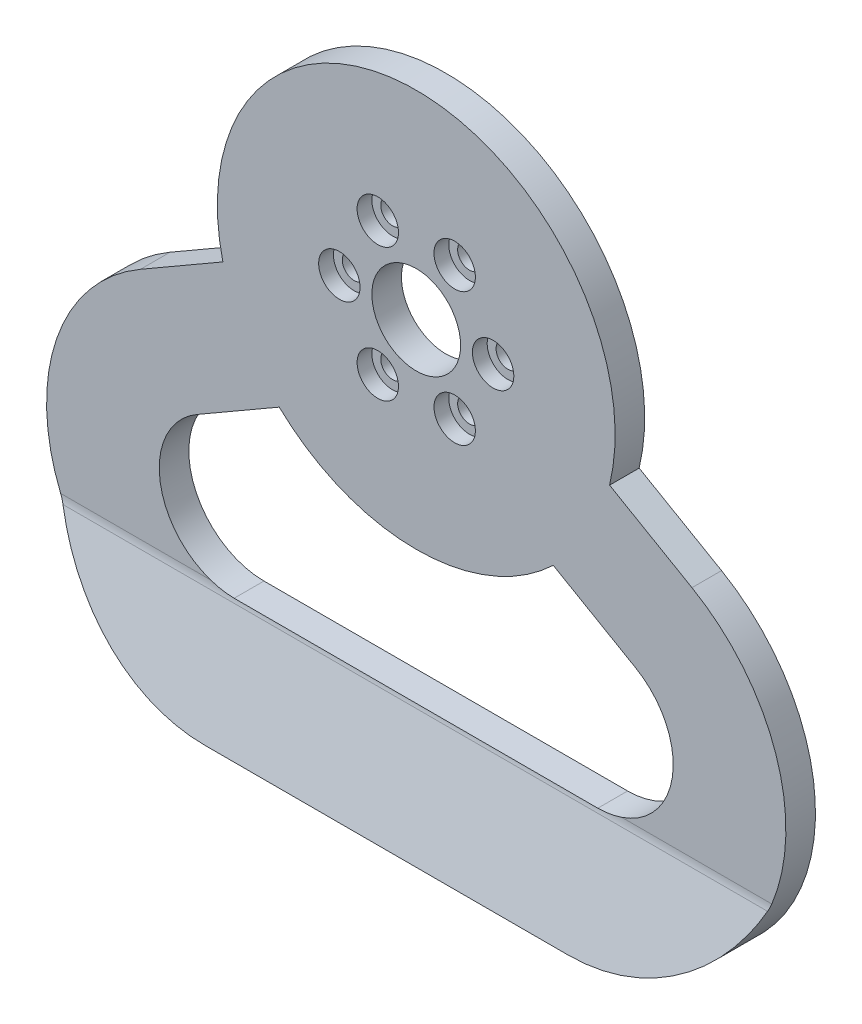
ISO-10303-21;
HEADER;
FILE_DESCRIPTION(('STEP AP214'),'2;1');
FILE_NAME('part.step','',(''),(''),'','','');
FILE_SCHEMA(('AUTOMOTIVE_DESIGN { 1 0 10303 214 1 1 1 1 }'));
ENDSEC;
DATA;
#1=APPLICATION_CONTEXT('core data for automotive mechanical design processes');
#2=APPLICATION_PROTOCOL_DEFINITION('international standard','automotive_design',2000,#1);
#3=PRODUCT_CONTEXT('',#1,'mechanical');
#4=PRODUCT('Part','Part','',(#3));
#5=PRODUCT_RELATED_PRODUCT_CATEGORY('part','',(#4));
#6=PRODUCT_DEFINITION_FORMATION('','',#4);
#7=PRODUCT_DEFINITION_CONTEXT('part definition',#1,'design');
#8=PRODUCT_DEFINITION('design','',#6,#7);
#9=PRODUCT_DEFINITION_SHAPE('','',#8);
#10=(LENGTH_UNIT() NAMED_UNIT(*) SI_UNIT(.MILLI.,.METRE.));
#11=(NAMED_UNIT(*) PLANE_ANGLE_UNIT() SI_UNIT($,.RADIAN.));
#12=(NAMED_UNIT(*) SI_UNIT($,.STERADIAN.) SOLID_ANGLE_UNIT());
#13=UNCERTAINTY_MEASURE_WITH_UNIT(LENGTH_MEASURE(1.E-05),#10,'distance_accuracy_value','');
#14=(GEOMETRIC_REPRESENTATION_CONTEXT(3) GLOBAL_UNCERTAINTY_ASSIGNED_CONTEXT((#13)) GLOBAL_UNIT_ASSIGNED_CONTEXT((#10,
#11,#12)) REPRESENTATION_CONTEXT('',''));
#15=CARTESIAN_POINT('',(0.,0.,0.));
#16=DIRECTION('',(0.,0.,1.));
#17=DIRECTION('',(1.,0.,0.));
#18=AXIS2_PLACEMENT_3D('',#15,#16,#17);
#19=CARTESIAN_POINT('',(-13.,0.,10.));
#20=DIRECTION('',(0.,0.,-1.));
#21=DIRECTION('',(-1.,0.,0.));
#22=AXIS2_PLACEMENT_3D('',#19,#20,#21);
#23=CYLINDRICAL_SURFACE('',#22,2.);
#24=CARTESIAN_POINT('',(-13.,0.,0.));
#25=DIRECTION('',(0.,0.,1.));
#26=DIRECTION('',(1.,0.,0.));
#27=AXIS2_PLACEMENT_3D('',#24,#25,#26);
#28=CIRCLE('',#27,2.);
#29=CARTESIAN_POINT('',(-11.,0.,0.));
#30=VERTEX_POINT('',#29);
#31=EDGE_CURVE('E666',#30,#30,#28,.T.);
#32=ORIENTED_EDGE('',*,*,#31,.F.);
#33=EDGE_LOOP('',(#32));
#34=FACE_BOUND('',#33,.T.);
#35=CARTESIAN_POINT('',(-13.,0.,2.5));
#36=DIRECTION('',(0.,0.,1.));
#37=DIRECTION('',(1.,0.,0.));
#38=AXIS2_PLACEMENT_3D('',#35,#36,#37);
#39=CIRCLE('',#38,2.);
#40=CARTESIAN_POINT('',(-11.,0.,2.5));
#41=VERTEX_POINT('',#40);
#42=EDGE_CURVE('E38',#41,#41,#39,.T.);
#43=ORIENTED_EDGE('',*,*,#42,.T.);
#44=EDGE_LOOP('',(#43));
#45=FACE_BOUND('',#44,.T.);
#46=ADVANCED_FACE('F33',(#34,#45),#23,.F.);
#47=CARTESIAN_POINT('',(-6.49999999999997,-11.2583302491977,10.));
#48=DIRECTION('',(0.,0.,-1.));
#49=DIRECTION('',(-1.,0.,0.));
#50=AXIS2_PLACEMENT_3D('',#47,#48,#49);
#51=CYLINDRICAL_SURFACE('',#50,2.);
#52=CARTESIAN_POINT('',(-6.49999999999997,-11.2583302491977,0.));
#53=DIRECTION('',(0.,0.,1.));
#54=DIRECTION('',(1.,0.,0.));
#55=AXIS2_PLACEMENT_3D('',#52,#53,#54);
#56=CIRCLE('',#55,2.);
#57=CARTESIAN_POINT('',(-4.49999999999997,-11.2583302491977,0.));
#58=VERTEX_POINT('',#57);
#59=EDGE_CURVE('E662',#58,#58,#56,.T.);
#60=ORIENTED_EDGE('',*,*,#59,.F.);
#61=EDGE_LOOP('',(#60));
#62=FACE_BOUND('',#61,.T.);
#63=CARTESIAN_POINT('',(-6.49999999999997,-11.2583302491977,2.5));
#64=DIRECTION('',(0.,0.,1.));
#65=DIRECTION('',(1.,0.,0.));
#66=AXIS2_PLACEMENT_3D('',#63,#64,#65);
#67=CIRCLE('',#66,2.);
#68=CARTESIAN_POINT('',(-4.49999999999997,-11.2583302491977,2.5));
#69=VERTEX_POINT('',#68);
#70=EDGE_CURVE('E695',#69,#69,#67,.T.);
#71=ORIENTED_EDGE('',*,*,#70,.T.);
#72=EDGE_LOOP('',(#71));
#73=FACE_BOUND('',#72,.T.);
#74=ADVANCED_FACE('F326',(#62,#73),#51,.F.);
#75=CARTESIAN_POINT('',(6.49999999999998,-11.2583302491977,10.));
#76=DIRECTION('',(0.,0.,-1.));
#77=DIRECTION('',(-1.,0.,0.));
#78=AXIS2_PLACEMENT_3D('',#75,#76,#77);
#79=CYLINDRICAL_SURFACE('',#78,2.);
#80=CARTESIAN_POINT('',(6.49999999999998,-11.2583302491977,0.));
#81=DIRECTION('',(0.,0.,1.));
#82=DIRECTION('',(1.,0.,0.));
#83=AXIS2_PLACEMENT_3D('',#80,#81,#82);
#84=CIRCLE('',#83,2.);
#85=CARTESIAN_POINT('',(8.49999999999998,-11.2583302491977,0.));
#86=VERTEX_POINT('',#85);
#87=EDGE_CURVE('E665',#86,#86,#84,.T.);
#88=ORIENTED_EDGE('',*,*,#87,.F.);
#89=EDGE_LOOP('',(#88));
#90=FACE_BOUND('',#89,.T.);
#91=CARTESIAN_POINT('',(6.49999999999998,-11.2583302491977,2.5));
#92=DIRECTION('',(0.,0.,1.));
#93=DIRECTION('',(1.,0.,0.));
#94=AXIS2_PLACEMENT_3D('',#91,#92,#93);
#95=CIRCLE('',#94,2.);
#96=CARTESIAN_POINT('',(8.49999999999998,-11.2583302491977,2.5));
#97=VERTEX_POINT('',#96);
#98=EDGE_CURVE('E694',#97,#97,#95,.T.);
#99=ORIENTED_EDGE('',*,*,#98,.T.);
#100=EDGE_LOOP('',(#99));
#101=FACE_BOUND('',#100,.T.);
#102=ADVANCED_FACE('F333',(#90,#101),#79,.F.);
#103=CARTESIAN_POINT('',(13.,0.,10.));
#104=DIRECTION('',(0.,0.,-1.));
#105=DIRECTION('',(-1.,0.,0.));
#106=AXIS2_PLACEMENT_3D('',#103,#104,#105);
#107=CYLINDRICAL_SURFACE('',#106,2.);
#108=CARTESIAN_POINT('',(13.,0.,0.));
#109=DIRECTION('',(0.,0.,1.));
#110=DIRECTION('',(1.,0.,0.));
#111=AXIS2_PLACEMENT_3D('',#108,#109,#110);
#112=CIRCLE('',#111,2.);
#113=CARTESIAN_POINT('',(15.,0.,0.));
#114=VERTEX_POINT('',#113);
#115=EDGE_CURVE('E676',#114,#114,#112,.T.);
#116=ORIENTED_EDGE('',*,*,#115,.F.);
#117=EDGE_LOOP('',(#116));
#118=FACE_BOUND('',#117,.T.);
#119=CARTESIAN_POINT('',(13.,0.,2.5));
#120=DIRECTION('',(0.,0.,1.));
#121=DIRECTION('',(1.,0.,0.));
#122=AXIS2_PLACEMENT_3D('',#119,#120,#121);
#123=CIRCLE('',#122,2.);
#124=CARTESIAN_POINT('',(15.,0.,2.5));
#125=VERTEX_POINT('',#124);
#126=EDGE_CURVE('E696',#125,#125,#123,.T.);
#127=ORIENTED_EDGE('',*,*,#126,.T.);
#128=EDGE_LOOP('',(#127));
#129=FACE_BOUND('',#128,.T.);
#130=ADVANCED_FACE('F347',(#118,#129),#107,.F.);
#131=CARTESIAN_POINT('',(6.49999999999996,11.2583302491977,10.));
#132=DIRECTION('',(0.,0.,-1.));
#133=DIRECTION('',(-1.,0.,0.));
#134=AXIS2_PLACEMENT_3D('',#131,#132,#133);
#135=CYLINDRICAL_SURFACE('',#134,2.);
#136=CARTESIAN_POINT('',(6.49999999999996,11.2583302491977,0.));
#137=DIRECTION('',(0.,0.,1.));
#138=DIRECTION('',(1.,0.,0.));
#139=AXIS2_PLACEMENT_3D('',#136,#137,#138);
#140=CIRCLE('',#139,2.);
#141=CARTESIAN_POINT('',(8.49999999999996,11.2583302491977,0.));
#142=VERTEX_POINT('',#141);
#143=EDGE_CURVE('E673',#142,#142,#140,.T.);
#144=ORIENTED_EDGE('',*,*,#143,.F.);
#145=EDGE_LOOP('',(#144));
#146=FACE_BOUND('',#145,.T.);
#147=CARTESIAN_POINT('',(6.49999999999996,11.2583302491977,2.5));
#148=DIRECTION('',(0.,0.,1.));
#149=DIRECTION('',(1.,0.,0.));
#150=AXIS2_PLACEMENT_3D('',#147,#148,#149);
#151=CIRCLE('',#150,2.);
#152=CARTESIAN_POINT('',(8.49999999999996,11.2583302491977,2.5));
#153=VERTEX_POINT('',#152);
#154=EDGE_CURVE('E700',#153,#153,#151,.T.);
#155=ORIENTED_EDGE('',*,*,#154,.T.);
#156=EDGE_LOOP('',(#155));
#157=FACE_BOUND('',#156,.T.);
#158=ADVANCED_FACE('F343',(#146,#157),#135,.F.);
#159=CARTESIAN_POINT('',(-6.49999999999997,11.2583302491977,10.));
#160=DIRECTION('',(0.,0.,-1.));
#161=DIRECTION('',(-1.,0.,0.));
#162=AXIS2_PLACEMENT_3D('',#159,#160,#161);
#163=CYLINDRICAL_SURFACE('',#162,2.);
#164=CARTESIAN_POINT('',(-6.49999999999997,11.2583302491977,0.));
#165=DIRECTION('',(0.,0.,1.));
#166=DIRECTION('',(1.,0.,0.));
#167=AXIS2_PLACEMENT_3D('',#164,#165,#166);
#168=CIRCLE('',#167,2.);
#169=CARTESIAN_POINT('',(-4.49999999999997,11.2583302491977,0.));
#170=VERTEX_POINT('',#169);
#171=EDGE_CURVE('E669',#170,#170,#168,.T.);
#172=ORIENTED_EDGE('',*,*,#171,.F.);
#173=EDGE_LOOP('',(#172));
#174=FACE_BOUND('',#173,.T.);
#175=CARTESIAN_POINT('',(-6.49999999999997,11.2583302491977,2.5));
#176=DIRECTION('',(0.,0.,1.));
#177=DIRECTION('',(1.,0.,0.));
#178=AXIS2_PLACEMENT_3D('',#175,#176,#177);
#179=CIRCLE('',#178,2.);
#180=CARTESIAN_POINT('',(-4.49999999999997,11.2583302491977,2.5));
#181=VERTEX_POINT('',#180);
#182=EDGE_CURVE('E298',#181,#181,#179,.T.);
#183=ORIENTED_EDGE('',*,*,#182,.T.);
#184=EDGE_LOOP('',(#183));
#185=FACE_BOUND('',#184,.T.);
#186=ADVANCED_FACE('F340',(#174,#185),#163,.F.);
#187=CARTESIAN_POINT('',(0.,-75.1775588832577,5.));
#188=DIRECTION('',(0.,1.,0.));
#189=DIRECTION('',(0.,0.,1.));
#190=AXIS2_PLACEMENT_3D('',#187,#188,#189);
#191=PLANE('',#190);
#192=DIRECTION('',(0.,0.,-1.));
#193=VECTOR('',#192,1.);
#194=CARTESIAN_POINT('',(30.7422046406712,-75.1775588832577,5.));
#195=LINE('',#194,#193);
#196=CARTESIAN_POINT('',(30.7422046406712,-75.1775588832576,10.));
#197=VERTEX_POINT('',#196);
#198=CARTESIAN_POINT('',(30.7422046406712,-75.1775588832577,0.));
#199=VERTEX_POINT('',#198);
#200=EDGE_CURVE('E146',#197,#199,#195,.T.);
#201=ORIENTED_EDGE('',*,*,#200,.F.);
#202=DIRECTION('',(1.,0.,0.));
#203=VECTOR('',#202,1.);
#204=CARTESIAN_POINT('',(-62.5,-75.1775588832576,10.));
#205=LINE('',#204,#203);
#206=CARTESIAN_POINT('',(-30.7422046406712,-75.1775588832576,10.));
#207=VERTEX_POINT('',#206);
#208=EDGE_CURVE('E160',#207,#197,#205,.T.);
#209=ORIENTED_EDGE('',*,*,#208,.F.);
#210=DIRECTION('',(0.,0.,-1.));
#211=VECTOR('',#210,1.);
#212=CARTESIAN_POINT('',(-30.7422046406712,-75.1775588832576,5.));
#213=LINE('',#212,#211);
#214=CARTESIAN_POINT('',(-30.7422046406712,-75.1775588832576,0.));
#215=VERTEX_POINT('',#214);
#216=EDGE_CURVE('E192',#207,#215,#213,.T.);
#217=ORIENTED_EDGE('',*,*,#216,.T.);
#218=DIRECTION('',(1.,0.,0.));
#219=VECTOR('',#218,1.);
#220=CARTESIAN_POINT('',(0.,-75.1775588832577,0.));
#221=LINE('',#220,#219);
#222=EDGE_CURVE('E162',#215,#199,#221,.T.);
#223=ORIENTED_EDGE('',*,*,#222,.T.);
#224=EDGE_LOOP('',(#201,#209,#217,#223));
#225=FACE_BOUND('',#224,.T.);
#226=ADVANCED_FACE('F158',(#225),#191,.F.);
#227=CARTESIAN_POINT('',(0.,0.,5.));
#228=DIRECTION('',(0.,0.,1.));
#229=DIRECTION('',(1.,0.,0.));
#230=AXIS2_PLACEMENT_3D('',#227,#228,#229);
#231=PLANE('',#230);
#232=CARTESIAN_POINT('',(6.49999999999996,11.2583302491977,5.));
#233=DIRECTION('',(0.,0.,1.));
#234=DIRECTION('',(1.,0.,0.));
#235=AXIS2_PLACEMENT_3D('',#232,#233,#234);
#236=CIRCLE('',#235,3.5);
#237=CARTESIAN_POINT('',(9.99999999999996,11.2583302491977,5.));
#238=VERTEX_POINT('',#237);
#239=EDGE_CURVE('E657',#238,#238,#236,.T.);
#240=ORIENTED_EDGE('',*,*,#239,.F.);
#241=EDGE_LOOP('',(#240));
#242=FACE_BOUND('',#241,.T.);
#243=CARTESIAN_POINT('',(13.,0.,5.));
#244=DIRECTION('',(0.,0.,1.));
#245=DIRECTION('',(1.,0.,0.));
#246=AXIS2_PLACEMENT_3D('',#243,#244,#245);
#247=CIRCLE('',#246,3.5);
#248=CARTESIAN_POINT('',(16.5,0.,5.));
#249=VERTEX_POINT('',#248);
#250=EDGE_CURVE('E651',#249,#249,#247,.T.);
#251=ORIENTED_EDGE('',*,*,#250,.F.);
#252=EDGE_LOOP('',(#251));
#253=FACE_BOUND('',#252,.T.);
#254=CARTESIAN_POINT('',(6.49999999999998,-11.2583302491977,5.));
#255=DIRECTION('',(0.,0.,1.));
#256=DIRECTION('',(1.,0.,0.));
#257=AXIS2_PLACEMENT_3D('',#254,#255,#256);
#258=CIRCLE('',#257,3.5);
#259=CARTESIAN_POINT('',(9.99999999999998,-11.2583302491977,5.));
#260=VERTEX_POINT('',#259);
#261=EDGE_CURVE('E645',#260,#260,#258,.T.);
#262=ORIENTED_EDGE('',*,*,#261,.F.);
#263=EDGE_LOOP('',(#262));
#264=FACE_BOUND('',#263,.T.);
#265=CARTESIAN_POINT('',(-6.49999999999997,-11.2583302491977,5.));
#266=DIRECTION('',(0.,0.,1.));
#267=DIRECTION('',(1.,0.,0.));
#268=AXIS2_PLACEMENT_3D('',#265,#266,#267);
#269=CIRCLE('',#268,3.5);
#270=CARTESIAN_POINT('',(-2.99999999999997,-11.2583302491977,5.));
#271=VERTEX_POINT('',#270);
#272=EDGE_CURVE('E639',#271,#271,#269,.T.);
#273=ORIENTED_EDGE('',*,*,#272,.F.);
#274=EDGE_LOOP('',(#273));
#275=FACE_BOUND('',#274,.T.);
#276=CARTESIAN_POINT('',(-13.,0.,5.));
#277=DIRECTION('',(0.,0.,1.));
#278=DIRECTION('',(1.,0.,0.));
#279=AXIS2_PLACEMENT_3D('',#276,#277,#278);
#280=CIRCLE('',#279,3.5);
#281=CARTESIAN_POINT('',(-9.5,0.,5.));
#282=VERTEX_POINT('',#281);
#283=EDGE_CURVE('E628',#282,#282,#280,.T.);
#284=ORIENTED_EDGE('',*,*,#283,.F.);
#285=EDGE_LOOP('',(#284));
#286=FACE_BOUND('',#285,.T.);
#287=CARTESIAN_POINT('',(-6.49999999999997,11.2583302491977,5.));
#288=DIRECTION('',(0.,0.,1.));
#289=DIRECTION('',(1.,0.,0.));
#290=AXIS2_PLACEMENT_3D('',#287,#288,#289);
#291=CIRCLE('',#290,3.5);
#292=CARTESIAN_POINT('',(-2.99999999999997,11.2583302491977,5.));
#293=VERTEX_POINT('',#292);
#294=EDGE_CURVE('E627',#293,#293,#291,.T.);
#295=ORIENTED_EDGE('',*,*,#294,.F.);
#296=EDGE_LOOP('',(#295));
#297=FACE_BOUND('',#296,.T.);
#298=CARTESIAN_POINT('',(0.,0.,5.));
#299=DIRECTION('',(0.,0.,1.));
#300=DIRECTION('',(1.,0.,0.));
#301=AXIS2_PLACEMENT_3D('',#298,#299,#300);
#302=CIRCLE('',#301,7.5);
#303=CARTESIAN_POINT('',(7.5,0.,5.));
#304=VERTEX_POINT('',#303);
#305=EDGE_CURVE('E175',#304,#304,#302,.F.);
#306=ORIENTED_EDGE('',*,*,#305,.T.);
#307=EDGE_LOOP('',(#306));
#308=FACE_BOUND('',#307,.T.);
#309=CARTESIAN_POINT('',(0.,0.,5.));
#310=DIRECTION('',(0.,0.,1.));
#311=DIRECTION('',(1.,0.,0.));
#312=AXIS2_PLACEMENT_3D('',#309,#310,#311);
#313=CIRCLE('',#312,33.625);
#314=CARTESIAN_POINT('',(-23.1638717331526,-24.3736675806095,5.));
#315=VERTEX_POINT('',#314);
#316=CARTESIAN_POINT('',(23.1638717331526,-24.3736675806095,5.));
#317=VERTEX_POINT('',#316);
#318=EDGE_CURVE('E238',#315,#317,#313,.T.);
#319=ORIENTED_EDGE('',*,*,#318,.T.);
#320=DIRECTION('',(0.86602540378444,-0.499999999999998,0.));
#321=VECTOR('',#320,1.);
#322=CARTESIAN_POINT('',(-4.7631397208144,-8.25000000000003,5.));
#323=LINE('',#322,#321);
#324=CARTESIAN_POINT('',(37.0948228787068,-32.4167059745627,5.));
#325=VERTEX_POINT('',#324);
#326=EDGE_CURVE('E198',#317,#325,#323,.T.);
#327=ORIENTED_EDGE('',*,*,#326,.T.);
#328=CARTESIAN_POINT('',(30.7422046406712,-43.4197635239289,5.));
#329=DIRECTION('',(0.,0.,1.));
#330=DIRECTION('',(1.,0.,0.));
#331=AXIS2_PLACEMENT_3D('',#328,#329,#330);
#332=CIRCLE('',#331,12.7052364760711);
#333=CARTESIAN_POINT('',(34.7393924268729,-55.4798432796655,5.));
#334=VERTEX_POINT('',#333);
#335=EDGE_CURVE('E173',#334,#325,#332,.T.);
#336=ORIENTED_EDGE('',*,*,#335,.F.);
#337=DIRECTION('',(-1.,0.,0.));
#338=VECTOR('',#337,1.);
#339=CARTESIAN_POINT('',(47.4301828160546,-55.4798432796655,5.));
#340=LINE('',#339,#338);
#341=CARTESIAN_POINT('',(60.1209732052363,-55.4798432796655,5.));
#342=VERTEX_POINT('',#341);
#343=EDGE_CURVE('E153',#334,#342,#340,.F.);
#344=ORIENTED_EDGE('',*,*,#343,.T.);
#345=CARTESIAN_POINT('',(30.7422046406712,-43.4197635239289,5.));
#346=DIRECTION('',(0.,0.,1.));
#347=DIRECTION('',(1.,0.,0.));
#348=AXIS2_PLACEMENT_3D('',#345,#346,#347);
#349=CIRCLE('',#348,31.7577953593288);
#350=CARTESIAN_POINT('',(46.6211023203355,-15.9167059745626,5.));
#351=VERTEX_POINT('',#350);
#352=EDGE_CURVE('E201',#342,#351,#349,.T.);
#353=ORIENTED_EDGE('',*,*,#352,.T.);
#354=DIRECTION('',(0.86602540378444,-0.499999999999998,0.));
#355=VECTOR('',#354,1.);
#356=CARTESIAN_POINT('',(4.7631397208144,8.25000000000003,5.));
#357=LINE('',#356,#355);
#358=CARTESIAN_POINT('',(32.6901511747813,-7.87366758060945,5.));
#359=VERTEX_POINT('',#358);
#360=EDGE_CURVE('E204',#359,#351,#357,.T.);
#361=ORIENTED_EDGE('',*,*,#360,.F.);
#362=CARTESIAN_POINT('',(-32.6901511747813,-7.87366758060957,5.));
#363=VERTEX_POINT('',#362);
#364=EDGE_CURVE('E242',#359,#363,#313,.T.);
#365=ORIENTED_EDGE('',*,*,#364,.T.);
#366=DIRECTION('',(-0.866025403784439,-0.5,0.));
#367=VECTOR('',#366,1.);
#368=CARTESIAN_POINT('',(-4.76313972081441,8.25,5.));
#369=LINE('',#368,#367);
#370=CARTESIAN_POINT('',(-46.6211023203356,-15.9167059745627,5.));
#371=VERTEX_POINT('',#370);
#372=EDGE_CURVE('E222',#363,#371,#369,.T.);
#373=ORIENTED_EDGE('',*,*,#372,.T.);
#374=CARTESIAN_POINT('',(-30.7422046406712,-43.4197635239289,5.));
#375=DIRECTION('',(0.,0.,1.));
#376=DIRECTION('',(1.,0.,0.));
#377=AXIS2_PLACEMENT_3D('',#374,#375,#376);
#378=CIRCLE('',#377,31.7577953593288);
#379=CARTESIAN_POINT('',(-60.1209732052363,-55.4798432796655,5.));
#380=VERTEX_POINT('',#379);
#381=EDGE_CURVE('E224',#371,#380,#378,.T.);
#382=ORIENTED_EDGE('',*,*,#381,.T.);
#383=DIRECTION('',(1.,0.,0.));
#384=VECTOR('',#383,1.);
#385=CARTESIAN_POINT('',(-30.7422046406712,-55.4798432796655,5.));
#386=LINE('',#385,#384);
#387=CARTESIAN_POINT('',(-34.7393924268729,-55.4798432796655,5.));
#388=VERTEX_POINT('',#387);
#389=EDGE_CURVE('E250',#380,#388,#386,.T.);
#390=ORIENTED_EDGE('',*,*,#389,.T.);
#391=CARTESIAN_POINT('',(-30.7422046406712,-43.4197635239289,5.));
#392=DIRECTION('',(0.,0.,1.));
#393=DIRECTION('',(1.,0.,0.));
#394=AXIS2_PLACEMENT_3D('',#391,#392,#393);
#395=CIRCLE('',#394,12.7052364760711);
#396=CARTESIAN_POINT('',(-37.0948228787067,-32.4167059745627,5.));
#397=VERTEX_POINT('',#396);
#398=EDGE_CURVE('E187',#397,#388,#395,.T.);
#399=ORIENTED_EDGE('',*,*,#398,.F.);
#400=DIRECTION('',(0.86602540378444,0.499999999999998,0.));
#401=VECTOR('',#400,1.);
#402=CARTESIAN_POINT('',(4.7631397208144,-8.25000000000002,5.));
#403=LINE('',#402,#401);
#404=EDGE_CURVE('E228',#397,#315,#403,.T.);
#405=ORIENTED_EDGE('',*,*,#404,.T.);
#406=EDGE_LOOP('',(#319,#327,#336,#344,#353,#361,#365,#373,#382,#390,#399,#405));
#407=FACE_BOUND('',#406,.T.);
#408=ADVANCED_FACE('F311',(#242,#253,#264,#275,#286,#297,#308,#407),#231,.T.);
#409=CARTESIAN_POINT('',(4.7631397208144,-8.25000000000002,5.));
#410=DIRECTION('',(-0.499999999999998,0.86602540378444,0.));
#411=DIRECTION('',(-0.86602540378444,-0.499999999999998,0.));
#412=AXIS2_PLACEMENT_3D('',#409,#410,#411);
#413=PLANE('',#412);
#414=DIRECTION('',(0.,0.,-1.));
#415=VECTOR('',#414,1.);
#416=CARTESIAN_POINT('',(-37.0948228787067,-32.4167059745627,5.));
#417=LINE('',#416,#415);
#418=CARTESIAN_POINT('',(-37.0948228787067,-32.4167059745627,0.));
#419=VERTEX_POINT('',#418);
#420=EDGE_CURVE('E194',#397,#419,#417,.T.);
#421=ORIENTED_EDGE('',*,*,#420,.T.);
#422=DIRECTION('',(0.86602540378444,0.499999999999998,0.));
#423=VECTOR('',#422,1.);
#424=CARTESIAN_POINT('',(4.7631397208144,-8.25000000000002,0.));
#425=LINE('',#424,#423);
#426=CARTESIAN_POINT('',(-23.1638717331526,-24.3736675806095,0.));
#427=VERTEX_POINT('',#426);
#428=EDGE_CURVE('E225',#419,#427,#425,.T.);
#429=ORIENTED_EDGE('',*,*,#428,.T.);
#430=DIRECTION('',(0.,0.,-1.));
#431=VECTOR('',#430,1.);
#432=CARTESIAN_POINT('',(-23.1638717331526,-24.3736675806095,5.));
#433=LINE('',#432,#431);
#434=EDGE_CURVE('E241',#427,#315,#433,.F.);
#435=ORIENTED_EDGE('',*,*,#434,.T.);
#436=ORIENTED_EDGE('',*,*,#404,.F.);
#437=EDGE_LOOP('',(#421,#429,#435,#436));
#438=FACE_BOUND('',#437,.T.);
#439=ADVANCED_FACE('F306',(#438),#413,.F.);
#440=CARTESIAN_POINT('',(0.,0.,5.));
#441=DIRECTION('',(0.,0.,-1.));
#442=DIRECTION('',(-1.,0.,0.));
#443=AXIS2_PLACEMENT_3D('',#440,#441,#442);
#444=CYLINDRICAL_SURFACE('',#443,33.625);
#445=DIRECTION('',(0.,0.,-1.));
#446=VECTOR('',#445,1.);
#447=CARTESIAN_POINT('',(23.1638717331526,-24.3736675806095,5.));
#448=LINE('',#447,#446);
#449=CARTESIAN_POINT('',(23.1638717331526,-24.3736675806095,0.));
#450=VERTEX_POINT('',#449);
#451=EDGE_CURVE('E218',#317,#450,#448,.T.);
#452=ORIENTED_EDGE('',*,*,#451,.F.);
#453=ORIENTED_EDGE('',*,*,#318,.F.);
#454=ORIENTED_EDGE('',*,*,#434,.F.);
#455=CARTESIAN_POINT('',(0.,0.,0.));
#456=DIRECTION('',(0.,0.,1.));
#457=DIRECTION('',(1.,0.,0.));
#458=AXIS2_PLACEMENT_3D('',#455,#456,#457);
#459=CIRCLE('',#458,33.625);
#460=EDGE_CURVE('E243',#427,#450,#459,.T.);
#461=ORIENTED_EDGE('',*,*,#460,.T.);
#462=EDGE_LOOP('',(#452,#453,#454,#461));
#463=FACE_BOUND('',#462,.T.);
#464=ADVANCED_FACE('F319',(#463),#444,.T.);
#465=ORIENTED_EDGE('',*,*,#364,.F.);
#466=DIRECTION('',(0.,0.,-1.));
#467=VECTOR('',#466,1.);
#468=CARTESIAN_POINT('',(32.6901511747813,-7.87366758060945,5.));
#469=LINE('',#468,#467);
#470=CARTESIAN_POINT('',(32.6901511747813,-7.87366758060945,0.));
#471=VERTEX_POINT('',#470);
#472=EDGE_CURVE('E215',#359,#471,#469,.T.);
#473=ORIENTED_EDGE('',*,*,#472,.T.);
#474=CARTESIAN_POINT('',(-32.6901511747813,-7.87366758060957,0.));
#475=VERTEX_POINT('',#474);
#476=EDGE_CURVE('E237',#471,#475,#459,.T.);
#477=ORIENTED_EDGE('',*,*,#476,.T.);
#478=DIRECTION('',(0.,0.,-1.));
#479=VECTOR('',#478,1.);
#480=CARTESIAN_POINT('',(-32.6901511747813,-7.87366758060957,5.));
#481=LINE('',#480,#479);
#482=EDGE_CURVE('E154',#363,#475,#481,.T.);
#483=ORIENTED_EDGE('',*,*,#482,.F.);
#484=EDGE_LOOP('',(#465,#473,#477,#483));
#485=FACE_BOUND('',#484,.T.);
#486=ADVANCED_FACE('F316',(#485),#444,.T.);
#487=CARTESIAN_POINT('',(0.,0.,0.));
#488=DIRECTION('',(0.,0.,1.));
#489=DIRECTION('',(1.,0.,0.));
#490=AXIS2_PLACEMENT_3D('',#487,#488,#489);
#491=PLANE('',#490);
#492=ORIENTED_EDGE('',*,*,#171,.T.);
#493=EDGE_LOOP('',(#492));
#494=FACE_BOUND('',#493,.T.);
#495=ORIENTED_EDGE('',*,*,#143,.T.);
#496=EDGE_LOOP('',(#495));
#497=FACE_BOUND('',#496,.T.);
#498=ORIENTED_EDGE('',*,*,#115,.T.);
#499=EDGE_LOOP('',(#498));
#500=FACE_BOUND('',#499,.T.);
#501=ORIENTED_EDGE('',*,*,#87,.T.);
#502=EDGE_LOOP('',(#501));
#503=FACE_BOUND('',#502,.T.);
#504=ORIENTED_EDGE('',*,*,#59,.T.);
#505=EDGE_LOOP('',(#504));
#506=FACE_BOUND('',#505,.T.);
#507=ORIENTED_EDGE('',*,*,#31,.T.);
#508=EDGE_LOOP('',(#507));
#509=FACE_BOUND('',#508,.T.);
#510=CARTESIAN_POINT('',(0.,0.,0.));
#511=DIRECTION('',(0.,0.,1.));
#512=DIRECTION('',(1.,0.,0.));
#513=AXIS2_PLACEMENT_3D('',#510,#511,#512);
#514=CIRCLE('',#513,7.5);
#515=CARTESIAN_POINT('',(7.5,0.,0.));
#516=VERTEX_POINT('',#515);
#517=EDGE_CURVE('E672',#516,#516,#514,.T.);
#518=ORIENTED_EDGE('',*,*,#517,.T.);
#519=EDGE_LOOP('',(#518));
#520=FACE_BOUND('',#519,.T.);
#521=DIRECTION('',(0.86602540378444,-0.499999999999998,0.));
#522=VECTOR('',#521,1.);
#523=CARTESIAN_POINT('',(-4.7631397208144,-8.25000000000003,0.));
#524=LINE('',#523,#522);
#525=CARTESIAN_POINT('',(37.0948228787067,-32.4167059745627,0.));
#526=VERTEX_POINT('',#525);
#527=EDGE_CURVE('E197',#450,#526,#524,.T.);
#528=ORIENTED_EDGE('',*,*,#527,.F.);
#529=ORIENTED_EDGE('',*,*,#460,.F.);
#530=ORIENTED_EDGE('',*,*,#428,.F.);
#531=CARTESIAN_POINT('',(-30.7422046406712,-43.4197635239289,0.));
#532=DIRECTION('',(0.,0.,1.));
#533=DIRECTION('',(1.,0.,0.));
#534=AXIS2_PLACEMENT_3D('',#531,#532,#533);
#535=CIRCLE('',#534,12.7052364760711);
#536=CARTESIAN_POINT('',(-30.7422046406712,-56.125,0.));
#537=VERTEX_POINT('',#536);
#538=EDGE_CURVE('E163',#419,#537,#535,.T.);
#539=ORIENTED_EDGE('',*,*,#538,.T.);
#540=DIRECTION('',(1.,0.,0.));
#541=VECTOR('',#540,1.);
#542=CARTESIAN_POINT('',(0.,-56.125,0.));
#543=LINE('',#542,#541);
#544=CARTESIAN_POINT('',(30.7422046406712,-56.125,0.));
#545=VERTEX_POINT('',#544);
#546=EDGE_CURVE('E164',#537,#545,#543,.T.);
#547=ORIENTED_EDGE('',*,*,#546,.T.);
#548=CARTESIAN_POINT('',(30.7422046406712,-43.4197635239289,0.));
#549=DIRECTION('',(0.,0.,1.));
#550=DIRECTION('',(1.,0.,0.));
#551=AXIS2_PLACEMENT_3D('',#548,#549,#550);
#552=CIRCLE('',#551,12.7052364760711);
#553=EDGE_CURVE('E170',#545,#526,#552,.T.);
#554=ORIENTED_EDGE('',*,*,#553,.T.);
#555=EDGE_LOOP('',(#528,#529,#530,#539,#547,#554));
#556=FACE_BOUND('',#555,.T.);
#557=ORIENTED_EDGE('',*,*,#476,.F.);
#558=DIRECTION('',(0.86602540378444,-0.499999999999998,0.));
#559=VECTOR('',#558,1.);
#560=CARTESIAN_POINT('',(4.7631397208144,8.25000000000003,0.));
#561=LINE('',#560,#559);
#562=CARTESIAN_POINT('',(46.6211023203355,-15.9167059745626,0.));
#563=VERTEX_POINT('',#562);
#564=EDGE_CURVE('E202',#471,#563,#561,.T.);
#565=ORIENTED_EDGE('',*,*,#564,.T.);
#566=CARTESIAN_POINT('',(30.7422046406712,-43.4197635239289,0.));
#567=DIRECTION('',(0.,0.,1.));
#568=DIRECTION('',(1.,0.,0.));
#569=AXIS2_PLACEMENT_3D('',#566,#567,#568);
#570=CIRCLE('',#569,31.7577953593288);
#571=EDGE_CURVE('E209',#199,#563,#570,.T.);
#572=ORIENTED_EDGE('',*,*,#571,.F.);
#573=ORIENTED_EDGE('',*,*,#222,.F.);
#574=CARTESIAN_POINT('',(-30.7422046406712,-43.4197635239289,0.));
#575=DIRECTION('',(0.,0.,1.));
#576=DIRECTION('',(1.,0.,0.));
#577=AXIS2_PLACEMENT_3D('',#574,#575,#576);
#578=CIRCLE('',#577,31.7577953593288);
#579=CARTESIAN_POINT('',(-46.6211023203356,-15.9167059745627,0.));
#580=VERTEX_POINT('',#579);
#581=EDGE_CURVE('E232',#580,#215,#578,.T.);
#582=ORIENTED_EDGE('',*,*,#581,.F.);
#583=DIRECTION('',(-0.866025403784439,-0.5,0.));
#584=VECTOR('',#583,1.);
#585=CARTESIAN_POINT('',(-4.76313972081441,8.25,0.));
#586=LINE('',#585,#584);
#587=EDGE_CURVE('E221',#475,#580,#586,.T.);
#588=ORIENTED_EDGE('',*,*,#587,.F.);
#589=EDGE_LOOP('',(#557,#565,#572,#573,#582,#588));
#590=FACE_BOUND('',#589,.T.);
#591=ADVANCED_FACE('F309',(#494,#497,#500,#503,#506,#509,#520,#556,#590),#491,.F.);
#592=CARTESIAN_POINT('',(-4.76313972081441,8.25,5.));
#593=DIRECTION('',(0.5,-0.866025403784438,0.));
#594=DIRECTION('',(0.866025403784438,0.5,0.));
#595=AXIS2_PLACEMENT_3D('',#592,#593,#594);
#596=PLANE('',#595);
#597=ORIENTED_EDGE('',*,*,#372,.F.);
#598=ORIENTED_EDGE('',*,*,#482,.T.);
#599=ORIENTED_EDGE('',*,*,#587,.T.);
#600=DIRECTION('',(0.,0.,-1.));
#601=VECTOR('',#600,1.);
#602=CARTESIAN_POINT('',(-46.6211023203356,-15.9167059745627,5.));
#603=LINE('',#602,#601);
#604=EDGE_CURVE('E230',#371,#580,#603,.T.);
#605=ORIENTED_EDGE('',*,*,#604,.F.);
#606=EDGE_LOOP('',(#597,#598,#599,#605));
#607=FACE_BOUND('',#606,.T.);
#608=ADVANCED_FACE('F304',(#607),#596,.F.);
#609=CARTESIAN_POINT('',(-30.7422046406712,-43.4197635239289,5.));
#610=DIRECTION('',(0.,0.,-1.));
#611=DIRECTION('',(-1.,0.,0.));
#612=AXIS2_PLACEMENT_3D('',#609,#610,#611);
#613=CYLINDRICAL_SURFACE('',#612,31.7577953593288);
#614=ORIENTED_EDGE('',*,*,#216,.F.);
#615=CARTESIAN_POINT('',(-30.7422046406712,-43.4197635239289,1.66574013655567));
#616=DIRECTION('',(0.,0.253836541283405,0.967247129904906));
#617=DIRECTION('',(0.,0.967247129904906,-0.253836541283405));
#618=AXIS2_PLACEMENT_3D('',#615,#616,#617);
#619=ELLIPSE('',#618,32.8331761113119,31.7577953593287);
#620=CARTESIAN_POINT('',(-59.5673382622179,-56.7490259860825,5.16376435047547));
#621=VERTEX_POINT('',#620);
#622=EDGE_CURVE('E169',#207,#621,#619,.F.);
#623=ORIENTED_EDGE('',*,*,#622,.T.);
#624=CARTESIAN_POINT('',(-59.5673382622179,-56.7490259860825,5.16376435047547));
#625=CARTESIAN_POINT('',(-59.6149761954838,-56.6460131189256,5.13672923503533));
#626=CARTESIAN_POINT('',(-59.6623850307836,-56.5420334694172,5.11296100852098));
#627=CARTESIAN_POINT('',(-59.7563866222658,-56.3328526383885,5.07215178636115));
#628=CARTESIAN_POINT('',(-59.8029816619456,-56.2276570381824,5.05508742829317));
#629=CARTESIAN_POINT('',(-59.8953363493689,-56.0160250776643,5.02768738464942));
#630=CARTESIAN_POINT('',(-59.9410959818559,-55.9095886947506,5.01735182183908));
#631=CARTESIAN_POINT('',(-60.0317632272901,-55.6954686297556,5.0034950699628));
#632=CARTESIAN_POINT('',(-60.0766672636185,-55.5877818715148,4.99999805729691));
#633=CARTESIAN_POINT('',(-60.1209732052363,-55.4798432796655,5.));
#634=B_SPLINE_CURVE_WITH_KNOTS('',3,(#624,#625,#626,#627,#628,#629,#630,#631,#632,#633),
.UNSPECIFIED.,.F.,.F.,(4,2,2,2,4),(0.,0.349964977819084,0.698699302319832,1.04743998922562,
1.39741136974465),.UNSPECIFIED.);
#635=EDGE_CURVE('E11',#621,#380,#634,.T.);
#636=ORIENTED_EDGE('',*,*,#635,.T.);
#637=ORIENTED_EDGE('',*,*,#381,.F.);
#638=ORIENTED_EDGE('',*,*,#604,.T.);
#639=ORIENTED_EDGE('',*,*,#581,.T.);
#640=EDGE_LOOP('',(#614,#623,#636,#637,#638,#639));
#641=FACE_BOUND('',#640,.T.);
#642=ADVANCED_FACE('F300',(#641),#613,.T.);
#643=CARTESIAN_POINT('',(-4.7631397208144,-8.25000000000003,5.));
#644=DIRECTION('',(0.499999999999998,0.86602540378444,0.));
#645=DIRECTION('',(-0.86602540378444,0.499999999999998,0.));
#646=AXIS2_PLACEMENT_3D('',#643,#644,#645);
#647=PLANE('',#646);
#648=ORIENTED_EDGE('',*,*,#527,.T.);
#649=DIRECTION('',(0.,0.,-1.));
#650=VECTOR('',#649,1.);
#651=CARTESIAN_POINT('',(37.0948228787068,-32.4167059745627,5.));
#652=LINE('',#651,#650);
#653=EDGE_CURVE('E179',#325,#526,#652,.T.);
#654=ORIENTED_EDGE('',*,*,#653,.F.);
#655=ORIENTED_EDGE('',*,*,#326,.F.);
#656=ORIENTED_EDGE('',*,*,#451,.T.);
#657=EDGE_LOOP('',(#648,#654,#655,#656));
#658=FACE_BOUND('',#657,.T.);
#659=ADVANCED_FACE('F275',(#658),#647,.F.);
#660=CARTESIAN_POINT('',(4.7631397208144,8.25000000000003,5.));
#661=DIRECTION('',(0.499999999999998,0.86602540378444,0.));
#662=DIRECTION('',(-0.86602540378444,0.499999999999998,0.));
#663=AXIS2_PLACEMENT_3D('',#660,#661,#662);
#664=PLANE('',#663);
#665=ORIENTED_EDGE('',*,*,#472,.F.);
#666=ORIENTED_EDGE('',*,*,#360,.T.);
#667=DIRECTION('',(0.,0.,-1.));
#668=VECTOR('',#667,1.);
#669=CARTESIAN_POINT('',(46.6211023203355,-15.9167059745626,5.));
#670=LINE('',#669,#668);
#671=EDGE_CURVE('E207',#351,#563,#670,.T.);
#672=ORIENTED_EDGE('',*,*,#671,.T.);
#673=ORIENTED_EDGE('',*,*,#564,.F.);
#674=EDGE_LOOP('',(#665,#666,#672,#673));
#675=FACE_BOUND('',#674,.T.);
#676=ADVANCED_FACE('F272',(#675),#664,.T.);
#677=CARTESIAN_POINT('',(30.7422046406712,-43.4197635239289,5.));
#678=DIRECTION('',(0.,0.,-1.));
#679=DIRECTION('',(-1.,0.,0.));
#680=AXIS2_PLACEMENT_3D('',#677,#678,#679);
#681=CYLINDRICAL_SURFACE('',#680,31.7577953593288);
#682=ORIENTED_EDGE('',*,*,#571,.T.);
#683=ORIENTED_EDGE('',*,*,#671,.F.);
#684=ORIENTED_EDGE('',*,*,#352,.F.);
#685=CARTESIAN_POINT('',(60.1209732052363,-55.4798432796655,5.));
#686=CARTESIAN_POINT('',(60.0766672636186,-55.5877818715148,4.99999805729691));
#687=CARTESIAN_POINT('',(60.0317632272901,-55.6954686297556,5.0034950699628));
#688=CARTESIAN_POINT('',(59.9410959818559,-55.9095886947506,5.01735182183908));
#689=CARTESIAN_POINT('',(59.895336349369,-56.0160250776643,5.02768738464942));
#690=CARTESIAN_POINT('',(59.8029816619456,-56.2276570381823,5.05508742829317));
#691=CARTESIAN_POINT('',(59.7563866222658,-56.3328526383885,5.07215178636115));
#692=CARTESIAN_POINT('',(59.6623850307836,-56.5420334694172,5.11296100852098));
#693=CARTESIAN_POINT('',(59.6149761954839,-56.6460131189256,5.13672923503533));
#694=CARTESIAN_POINT('',(59.5673382622181,-56.7490259860825,5.16376435047547));
#695=B_SPLINE_CURVE_WITH_KNOTS('',3,(#685,#686,#687,#688,#689,#690,#691,#692,#693,#694),
.UNSPECIFIED.,.F.,.F.,(4,2,2,2,4),(0.,0.349971380519021,0.698712067424805,1.04744639192555,
1.39741136974463),.UNSPECIFIED.);
#696=CARTESIAN_POINT('',(59.567338262218,-56.7490259860825,5.16376435047547));
#697=VERTEX_POINT('',#696);
#698=EDGE_CURVE('E43',#342,#697,#695,.T.);
#699=ORIENTED_EDGE('',*,*,#698,.T.);
#700=CARTESIAN_POINT('',(30.7422046406712,-43.4197635239289,1.66574013655567));
#701=DIRECTION('',(0.,0.253836541283405,0.967247129904906));
#702=DIRECTION('',(0.,0.967247129904906,-0.253836541283405));
#703=AXIS2_PLACEMENT_3D('',#700,#701,#702);
#704=ELLIPSE('',#703,32.8331761113119,31.7577953593288);
#705=EDGE_CURVE('E143',#697,#197,#704,.F.);
#706=ORIENTED_EDGE('',*,*,#705,.T.);
#707=ORIENTED_EDGE('',*,*,#200,.T.);
#708=EDGE_LOOP('',(#682,#683,#684,#699,#706,#707));
#709=FACE_BOUND('',#708,.T.);
#710=ADVANCED_FACE('F145',(#709),#681,.T.);
#711=CARTESIAN_POINT('',(-30.7422046406712,-43.4197635239289,5.));
#712=DIRECTION('',(0.,0.,-1.));
#713=DIRECTION('',(-1.,0.,0.));
#714=AXIS2_PLACEMENT_3D('',#711,#712,#713);
#715=CYLINDRICAL_SURFACE('',#714,12.7052364760711);
#716=ORIENTED_EDGE('',*,*,#538,.F.);
#717=ORIENTED_EDGE('',*,*,#420,.F.);
#718=ORIENTED_EDGE('',*,*,#398,.T.);
#719=CARTESIAN_POINT('',(-34.7393924268729,-55.4798432796655,5.));
#720=CARTESIAN_POINT('',(-34.5780401280718,-55.5333239267345,5.00001253600264));
#721=CARTESIAN_POINT('',(-34.4156174571801,-55.5835613570625,5.00085845531684));
#722=CARTESIAN_POINT('',(-34.088901232719,-55.6774766912295,5.00368321208684));
#723=CARTESIAN_POINT('',(-33.9246077376652,-55.7211547996276,5.00566201420332));
#724=CARTESIAN_POINT('',(-33.5954612779869,-55.8016246343627,5.01020424267913));
#725=CARTESIAN_POINT('',(-33.4306185432161,-55.838458453466,5.01276386480062));
#726=CARTESIAN_POINT('',(-33.0995972292446,-55.9055254747521,5.01803969630345));
#727=CARTESIAN_POINT('',(-32.9334186427144,-55.9357586406929,5.02075590654444));
#728=CARTESIAN_POINT('',(-32.5999816150042,-55.9895772983444,5.02597722897898));
#729=CARTESIAN_POINT('',(-32.4327231520259,-56.013162655431,5.0284823368968));
#730=CARTESIAN_POINT('',(-32.0973927685924,-56.0536473757171,5.03299274144582));
#731=CARTESIAN_POINT('',(-31.9293208514017,-56.0705467657248,5.03499804008107));
#732=CARTESIAN_POINT('',(-31.5915519462261,-56.0977179750457,5.03830367054555));
#733=CARTESIAN_POINT('',(-31.4218514420973,-56.107946684623,5.03959940833441));
#734=CARTESIAN_POINT('',(-31.0821690390871,-56.1215888046137,5.04135408023582));
#735=CARTESIAN_POINT('',(-30.912187134526,-56.1250020757471,5.04181299724713));
#736=CARTESIAN_POINT('',(-30.7422046406712,-56.125,5.04179742182641));
#737=B_SPLINE_CURVE_WITH_KNOTS('',3,(#719,#720,#721,#722,#723,#724,#725,#726,#727,#728,#729,
#730,#731,#732,#733,#734,#735,#736),.UNSPECIFIED.,.F.,.F.,(4,2,2,2,2,2,2,2,4),(0.,
0.50991144252623,1.0198069796601,1.52645457608531,2.03310495427342,2.5397655918495,
3.04642419788291,3.55632549927637,4.06623722088608),.UNSPECIFIED.);
#738=CARTESIAN_POINT('',(-30.7422046406712,-56.125,5.0417974218264));
#739=VERTEX_POINT('',#738);
#740=EDGE_CURVE('E255',#388,#739,#737,.T.);
#741=ORIENTED_EDGE('',*,*,#740,.T.);
#742=DIRECTION('',(0.,0.,-1.));
#743=VECTOR('',#742,1.);
#744=CARTESIAN_POINT('',(-30.7422046406712,-56.125,5.));
#745=LINE('',#744,#743);
#746=EDGE_CURVE('E58',#739,#537,#745,.T.);
#747=ORIENTED_EDGE('',*,*,#746,.T.);
#748=EDGE_LOOP('',(#716,#717,#718,#741,#747));
#749=FACE_BOUND('',#748,.T.);
#750=ADVANCED_FACE('F264',(#749),#715,.F.);
#751=CARTESIAN_POINT('',(0.,-56.125,5.));
#752=DIRECTION('',(0.,1.,0.));
#753=DIRECTION('',(-1.,0.,0.));
#754=AXIS2_PLACEMENT_3D('',#751,#752,#753);
#755=PLANE('',#754);
#756=DIRECTION('',(0.,0.,-1.));
#757=VECTOR('',#756,1.);
#758=CARTESIAN_POINT('',(30.7422046406712,-56.125,5.));
#759=LINE('',#758,#757);
#760=CARTESIAN_POINT('',(30.7422046406712,-56.125,5.0417974218264));
#761=VERTEX_POINT('',#760);
#762=EDGE_CURVE('E51',#761,#545,#759,.T.);
#763=ORIENTED_EDGE('',*,*,#762,.T.);
#764=ORIENTED_EDGE('',*,*,#546,.F.);
#765=ORIENTED_EDGE('',*,*,#746,.F.);
#766=DIRECTION('',(-1.,0.,0.));
#767=VECTOR('',#766,1.);
#768=CARTESIAN_POINT('',(-30.7422046406712,-56.125,5.0417974218264));
#769=LINE('',#768,#767);
#770=EDGE_CURVE('E262',#739,#761,#769,.F.);
#771=ORIENTED_EDGE('',*,*,#770,.T.);
#772=EDGE_LOOP('',(#763,#764,#765,#771));
#773=FACE_BOUND('',#772,.T.);
#774=ADVANCED_FACE('F269',(#773),#755,.T.);
#775=CARTESIAN_POINT('',(30.7422046406712,-43.4197635239289,5.));
#776=DIRECTION('',(0.,0.,-1.));
#777=DIRECTION('',(-1.,0.,0.));
#778=AXIS2_PLACEMENT_3D('',#775,#776,#777);
#779=CYLINDRICAL_SURFACE('',#778,12.7052364760711);
#780=ORIENTED_EDGE('',*,*,#553,.F.);
#781=ORIENTED_EDGE('',*,*,#762,.F.);
#782=CARTESIAN_POINT('',(30.7422046406712,-56.125,5.0417974218264));
#783=CARTESIAN_POINT('',(30.912187134526,-56.1250020757471,5.04181299724712));
#784=CARTESIAN_POINT('',(31.0821690390871,-56.1215888046137,5.04135408023582));
#785=CARTESIAN_POINT('',(31.4218514420974,-56.107946684623,5.03959940833441));
#786=CARTESIAN_POINT('',(31.5915519462262,-56.0977179750457,5.03830367054555));
#787=CARTESIAN_POINT('',(31.9293208514017,-56.0705467657248,5.03499804008107));
#788=CARTESIAN_POINT('',(32.0973927685925,-56.0536473757171,5.03299274144582));
#789=CARTESIAN_POINT('',(32.4327231520259,-56.013162655431,5.0284823368968));
#790=CARTESIAN_POINT('',(32.5999816150042,-55.9895772983444,5.02597722897898));
#791=CARTESIAN_POINT('',(32.9334186427144,-55.9357586406929,5.02075590654444));
#792=CARTESIAN_POINT('',(33.0995972292446,-55.9055254747521,5.01803969630345));
#793=CARTESIAN_POINT('',(33.4306185432162,-55.838458453466,5.01276386480062));
#794=CARTESIAN_POINT('',(33.595461277987,-55.8016246343626,5.01020424267913));
#795=CARTESIAN_POINT('',(33.9246077376652,-55.7211547996275,5.00566201420332));
#796=CARTESIAN_POINT('',(34.088901232719,-55.6774766912295,5.00368321208684));
#797=CARTESIAN_POINT('',(34.4156174571801,-55.5835613570625,5.00085845531684));
#798=CARTESIAN_POINT('',(34.5780401280718,-55.5333239267345,5.00001253600264));
#799=CARTESIAN_POINT('',(34.7393924268729,-55.4798432796655,5.));
#800=B_SPLINE_CURVE_WITH_KNOTS('',3,(#782,#783,#784,#785,#786,#787,#788,#789,#790,#791,#792,
#793,#794,#795,#796,#797,#798,#799),.UNSPECIFIED.,.F.,.F.,(4,2,2,2,2,2,2,2,4),(0.,
0.509911721609714,1.01981302300318,1.52647162903658,2.03313226661266,2.53978264480078,
3.04643024122598,3.55632577835985,4.06623722088608),.UNSPECIFIED.);
#801=EDGE_CURVE('E286',#761,#334,#800,.T.);
#802=ORIENTED_EDGE('',*,*,#801,.T.);
#803=ORIENTED_EDGE('',*,*,#335,.T.);
#804=ORIENTED_EDGE('',*,*,#653,.T.);
#805=EDGE_LOOP('',(#780,#781,#802,#803,#804));
#806=FACE_BOUND('',#805,.T.);
#807=ADVANCED_FACE('F361',(#806),#779,.F.);
#808=CARTESIAN_POINT('',(-62.5,-56.125,5.));
#809=DIRECTION('',(0.,0.253836541283405,0.967247129904906));
#810=DIRECTION('',(0.,-0.967247129904906,0.253836541283405));
#811=AXIS2_PLACEMENT_3D('',#808,#809,#810);
#812=PLANE('',#811);
#813=ORIENTED_EDGE('',*,*,#705,.F.);
#814=DIRECTION('',(1.,0.,0.));
#815=VECTOR('',#814,1.);
#816=CARTESIAN_POINT('',(-59.8477802606811,-56.7490259860825,5.16376435047547));
#817=LINE('',#816,#815);
#818=EDGE_CURVE('E253',#697,#621,#817,.F.);
#819=ORIENTED_EDGE('',*,*,#818,.T.);
#820=ORIENTED_EDGE('',*,*,#622,.F.);
#821=ORIENTED_EDGE('',*,*,#208,.T.);
#822=EDGE_LOOP('',(#813,#819,#820,#821));
#823=FACE_BOUND('',#822,.T.);
#824=ADVANCED_FACE('F167',(#823),#812,.T.);
#825=CARTESIAN_POINT('',(0.,-55.4798432796655,10.));
#826=DIRECTION('',(-1.,0.,0.));
#827=DIRECTION('',(0.,0.,1.));
#828=AXIS2_PLACEMENT_3D('',#825,#826,#827);
#829=CYLINDRICAL_SURFACE('',#828,5.);
#830=ORIENTED_EDGE('',*,*,#635,.F.);
#831=ORIENTED_EDGE('',*,*,#818,.F.);
#832=ORIENTED_EDGE('',*,*,#698,.F.);
#833=ORIENTED_EDGE('',*,*,#343,.F.);
#834=ORIENTED_EDGE('',*,*,#801,.F.);
#835=ORIENTED_EDGE('',*,*,#770,.F.);
#836=ORIENTED_EDGE('',*,*,#740,.F.);
#837=ORIENTED_EDGE('',*,*,#389,.F.);
#838=EDGE_LOOP('',(#830,#831,#832,#833,#834,#835,#836,#837));
#839=FACE_BOUND('',#838,.T.);
#840=ADVANCED_FACE('F35',(#839),#829,.F.);
#841=CARTESIAN_POINT('',(0.,0.,10.));
#842=DIRECTION('',(0.,0.,-1.));
#843=DIRECTION('',(-1.,0.,0.));
#844=AXIS2_PLACEMENT_3D('',#841,#842,#843);
#845=CYLINDRICAL_SURFACE('',#844,7.5);
#846=ORIENTED_EDGE('',*,*,#305,.F.);
#847=EDGE_LOOP('',(#846));
#848=FACE_BOUND('',#847,.T.);
#849=ORIENTED_EDGE('',*,*,#517,.F.);
#850=EDGE_LOOP('',(#849));
#851=FACE_BOUND('',#850,.T.);
#852=ADVANCED_FACE('F355',(#848,#851),#845,.F.);
#853=CARTESIAN_POINT('',(-6.49999999999997,11.2583302491977,2.5));
#854=DIRECTION('',(0.,0.,1.));
#855=DIRECTION('',(1.,0.,0.));
#856=AXIS2_PLACEMENT_3D('',#853,#854,#855);
#857=CYLINDRICAL_SURFACE('',#856,3.5);
#858=CARTESIAN_POINT('',(-6.49999999999997,11.2583302491977,2.5));
#859=DIRECTION('',(0.,0.,1.));
#860=DIRECTION('',(1.,0.,0.));
#861=AXIS2_PLACEMENT_3D('',#858,#859,#860);
#862=CIRCLE('',#861,3.5);
#863=CARTESIAN_POINT('',(-2.99999999999997,11.2583302491977,2.5));
#864=VERTEX_POINT('',#863);
#865=EDGE_CURVE('E631',#864,#864,#862,.T.);
#866=ORIENTED_EDGE('',*,*,#865,.F.);
#867=EDGE_LOOP('',(#866));
#868=FACE_BOUND('',#867,.T.);
#869=ORIENTED_EDGE('',*,*,#294,.T.);
#870=EDGE_LOOP('',(#869));
#871=FACE_BOUND('',#870,.T.);
#872=ADVANCED_FACE('F358',(#868,#871),#857,.F.);
#873=CARTESIAN_POINT('',(-6.49999999999997,11.2583302491977,2.5));
#874=DIRECTION('',(0.,0.,1.));
#875=DIRECTION('',(1.,0.,0.));
#876=AXIS2_PLACEMENT_3D('',#873,#874,#875);
#877=PLANE('',#876);
#878=ORIENTED_EDGE('',*,*,#182,.F.);
#879=EDGE_LOOP('',(#878));
#880=FACE_BOUND('',#879,.T.);
#881=ORIENTED_EDGE('',*,*,#865,.T.);
#882=EDGE_LOOP('',(#881));
#883=FACE_BOUND('',#882,.T.);
#884=ADVANCED_FACE('F508',(#880,#883),#877,.T.);
#885=CARTESIAN_POINT('',(6.49999999999996,11.2583302491977,2.5));
#886=DIRECTION('',(0.,0.,1.));
#887=DIRECTION('',(1.,0.,0.));
#888=AXIS2_PLACEMENT_3D('',#885,#886,#887);
#889=CYLINDRICAL_SURFACE('',#888,3.5);
#890=CARTESIAN_POINT('',(6.49999999999996,11.2583302491977,2.5));
#891=DIRECTION('',(0.,0.,1.));
#892=DIRECTION('',(1.,0.,0.));
#893=AXIS2_PLACEMENT_3D('',#890,#891,#892);
#894=CIRCLE('',#893,3.5);
#895=CARTESIAN_POINT('',(9.99999999999996,11.2583302491977,2.5));
#896=VERTEX_POINT('',#895);
#897=EDGE_CURVE('E654',#896,#896,#894,.T.);
#898=ORIENTED_EDGE('',*,*,#897,.F.);
#899=EDGE_LOOP('',(#898));
#900=FACE_BOUND('',#899,.T.);
#901=ORIENTED_EDGE('',*,*,#239,.T.);
#902=EDGE_LOOP('',(#901));
#903=FACE_BOUND('',#902,.T.);
#904=ADVANCED_FACE('F517',(#900,#903),#889,.F.);
#905=CARTESIAN_POINT('',(6.49999999999996,11.2583302491977,2.5));
#906=DIRECTION('',(0.,0.,1.));
#907=DIRECTION('',(1.,0.,0.));
#908=AXIS2_PLACEMENT_3D('',#905,#906,#907);
#909=PLANE('',#908);
#910=ORIENTED_EDGE('',*,*,#154,.F.);
#911=EDGE_LOOP('',(#910));
#912=FACE_BOUND('',#911,.T.);
#913=ORIENTED_EDGE('',*,*,#897,.T.);
#914=EDGE_LOOP('',(#913));
#915=FACE_BOUND('',#914,.T.);
#916=ADVANCED_FACE('F527',(#912,#915),#909,.T.);
#917=CARTESIAN_POINT('',(13.,0.,2.5));
#918=DIRECTION('',(0.,0.,1.));
#919=DIRECTION('',(1.,0.,0.));
#920=AXIS2_PLACEMENT_3D('',#917,#918,#919);
#921=CYLINDRICAL_SURFACE('',#920,3.5);
#922=CARTESIAN_POINT('',(13.,0.,2.5));
#923=DIRECTION('',(0.,0.,1.));
#924=DIRECTION('',(1.,0.,0.));
#925=AXIS2_PLACEMENT_3D('',#922,#923,#924);
#926=CIRCLE('',#925,3.5);
#927=CARTESIAN_POINT('',(16.5,0.,2.5));
#928=VERTEX_POINT('',#927);
#929=EDGE_CURVE('E648',#928,#928,#926,.T.);
#930=ORIENTED_EDGE('',*,*,#929,.F.);
#931=EDGE_LOOP('',(#930));
#932=FACE_BOUND('',#931,.T.);
#933=ORIENTED_EDGE('',*,*,#250,.T.);
#934=EDGE_LOOP('',(#933));
#935=FACE_BOUND('',#934,.T.);
#936=ADVANCED_FACE('F537',(#932,#935),#921,.F.);
#937=CARTESIAN_POINT('',(13.,0.,2.5));
#938=DIRECTION('',(0.,0.,1.));
#939=DIRECTION('',(1.,0.,0.));
#940=AXIS2_PLACEMENT_3D('',#937,#938,#939);
#941=PLANE('',#940);
#942=ORIENTED_EDGE('',*,*,#126,.F.);
#943=EDGE_LOOP('',(#942));
#944=FACE_BOUND('',#943,.T.);
#945=ORIENTED_EDGE('',*,*,#929,.T.);
#946=EDGE_LOOP('',(#945));
#947=FACE_BOUND('',#946,.T.);
#948=ADVANCED_FACE('F547',(#944,#947),#941,.T.);
#949=CARTESIAN_POINT('',(6.49999999999998,-11.2583302491977,2.5));
#950=DIRECTION('',(0.,0.,1.));
#951=DIRECTION('',(1.,0.,0.));
#952=AXIS2_PLACEMENT_3D('',#949,#950,#951);
#953=CYLINDRICAL_SURFACE('',#952,3.5);
#954=CARTESIAN_POINT('',(6.49999999999998,-11.2583302491977,2.5));
#955=DIRECTION('',(0.,0.,1.));
#956=DIRECTION('',(1.,0.,0.));
#957=AXIS2_PLACEMENT_3D('',#954,#955,#956);
#958=CIRCLE('',#957,3.5);
#959=CARTESIAN_POINT('',(9.99999999999998,-11.2583302491977,2.5));
#960=VERTEX_POINT('',#959);
#961=EDGE_CURVE('E642',#960,#960,#958,.T.);
#962=ORIENTED_EDGE('',*,*,#961,.F.);
#963=EDGE_LOOP('',(#962));
#964=FACE_BOUND('',#963,.T.);
#965=ORIENTED_EDGE('',*,*,#261,.T.);
#966=EDGE_LOOP('',(#965));
#967=FACE_BOUND('',#966,.T.);
#968=ADVANCED_FACE('F557',(#964,#967),#953,.F.);
#969=CARTESIAN_POINT('',(6.49999999999998,-11.2583302491977,2.5));
#970=DIRECTION('',(0.,0.,1.));
#971=DIRECTION('',(1.,0.,0.));
#972=AXIS2_PLACEMENT_3D('',#969,#970,#971);
#973=PLANE('',#972);
#974=ORIENTED_EDGE('',*,*,#98,.F.);
#975=EDGE_LOOP('',(#974));
#976=FACE_BOUND('',#975,.T.);
#977=ORIENTED_EDGE('',*,*,#961,.T.);
#978=EDGE_LOOP('',(#977));
#979=FACE_BOUND('',#978,.T.);
#980=ADVANCED_FACE('F567',(#976,#979),#973,.T.);
#981=CARTESIAN_POINT('',(-6.49999999999997,-11.2583302491977,2.5));
#982=DIRECTION('',(0.,0.,1.));
#983=DIRECTION('',(1.,0.,0.));
#984=AXIS2_PLACEMENT_3D('',#981,#982,#983);
#985=CYLINDRICAL_SURFACE('',#984,3.5);
#986=CARTESIAN_POINT('',(-6.49999999999997,-11.2583302491977,2.5));
#987=DIRECTION('',(0.,0.,1.));
#988=DIRECTION('',(1.,0.,0.));
#989=AXIS2_PLACEMENT_3D('',#986,#987,#988);
#990=CIRCLE('',#989,3.5);
#991=CARTESIAN_POINT('',(-2.99999999999997,-11.2583302491977,2.5));
#992=VERTEX_POINT('',#991);
#993=EDGE_CURVE('E634',#992,#992,#990,.T.);
#994=ORIENTED_EDGE('',*,*,#993,.F.);
#995=EDGE_LOOP('',(#994));
#996=FACE_BOUND('',#995,.T.);
#997=ORIENTED_EDGE('',*,*,#272,.T.);
#998=EDGE_LOOP('',(#997));
#999=FACE_BOUND('',#998,.T.);
#1000=ADVANCED_FACE('F577',(#996,#999),#985,.F.);
#1001=CARTESIAN_POINT('',(-6.49999999999997,-11.2583302491977,2.5));
#1002=DIRECTION('',(0.,0.,1.));
#1003=DIRECTION('',(1.,0.,0.));
#1004=AXIS2_PLACEMENT_3D('',#1001,#1002,#1003);
#1005=PLANE('',#1004);
#1006=ORIENTED_EDGE('',*,*,#70,.F.);
#1007=EDGE_LOOP('',(#1006));
#1008=FACE_BOUND('',#1007,.T.);
#1009=ORIENTED_EDGE('',*,*,#993,.T.);
#1010=EDGE_LOOP('',(#1009));
#1011=FACE_BOUND('',#1010,.T.);
#1012=ADVANCED_FACE('F587',(#1008,#1011),#1005,.T.);
#1013=CARTESIAN_POINT('',(-13.,0.,2.5));
#1014=DIRECTION('',(0.,0.,1.));
#1015=DIRECTION('',(1.,0.,0.));
#1016=AXIS2_PLACEMENT_3D('',#1013,#1014,#1015);
#1017=CYLINDRICAL_SURFACE('',#1016,3.5);
#1018=CARTESIAN_POINT('',(-13.,0.,2.5));
#1019=DIRECTION('',(0.,0.,1.));
#1020=DIRECTION('',(1.,0.,0.));
#1021=AXIS2_PLACEMENT_3D('',#1018,#1019,#1020);
#1022=CIRCLE('',#1021,3.5);
#1023=CARTESIAN_POINT('',(-9.5,0.,2.5));
#1024=VERTEX_POINT('',#1023);
#1025=EDGE_CURVE('E626',#1024,#1024,#1022,.T.);
#1026=ORIENTED_EDGE('',*,*,#1025,.F.);
#1027=EDGE_LOOP('',(#1026));
#1028=FACE_BOUND('',#1027,.T.);
#1029=ORIENTED_EDGE('',*,*,#283,.T.);
#1030=EDGE_LOOP('',(#1029));
#1031=FACE_BOUND('',#1030,.T.);
#1032=ADVANCED_FACE('F597',(#1028,#1031),#1017,.F.);
#1033=CARTESIAN_POINT('',(-13.,0.,2.5));
#1034=DIRECTION('',(0.,0.,1.));
#1035=DIRECTION('',(1.,0.,0.));
#1036=AXIS2_PLACEMENT_3D('',#1033,#1034,#1035);
#1037=PLANE('',#1036);
#1038=ORIENTED_EDGE('',*,*,#42,.F.);
#1039=EDGE_LOOP('',(#1038));
#1040=FACE_BOUND('',#1039,.T.);
#1041=ORIENTED_EDGE('',*,*,#1025,.T.);
#1042=EDGE_LOOP('',(#1041));
#1043=FACE_BOUND('',#1042,.T.);
#1044=ADVANCED_FACE('F607',(#1040,#1043),#1037,.T.);
#1045=CLOSED_SHELL('',(#46,#74,#102,#130,#158,#186,#226,#408,#439,#464,#486,#591,#608,#642,#659,
#676,#710,#750,#774,#807,#824,#840,#852,#872,#884,#904,#916,#936,#948,#968,#980,#1000,#1012,
#1032,#1044));
#1046=MANIFOLD_SOLID_BREP('B2',#1045);
#1047=ADVANCED_BREP_SHAPE_REPRESENTATION('',(#18,#1046),#14);
#1048=SHAPE_DEFINITION_REPRESENTATION(#9,#1047);
ENDSEC;
END-ISO-10303-21;
